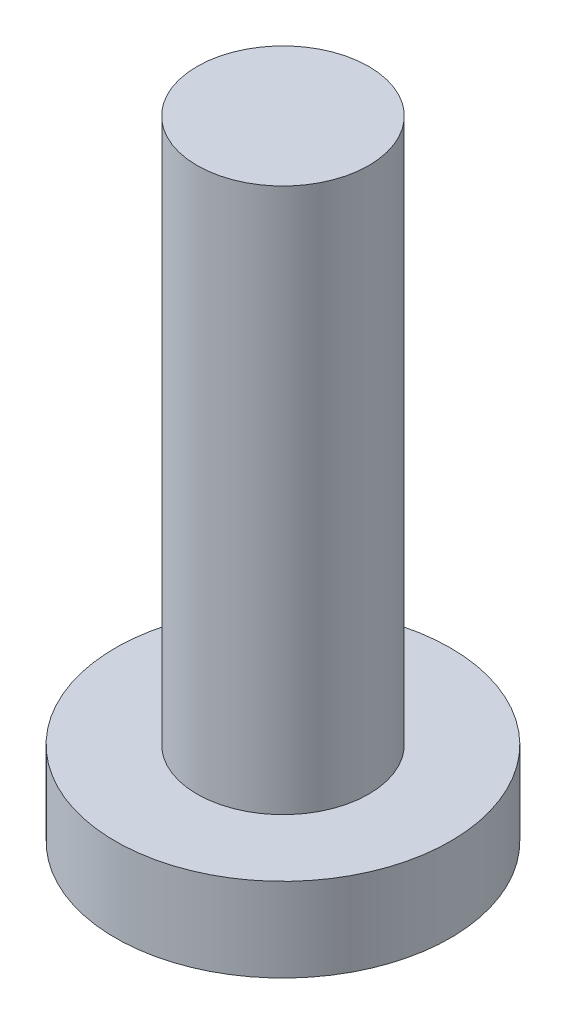
ISO-10303-21;
HEADER;
FILE_DESCRIPTION(('STEP AP214'),'2;1');
FILE_NAME('part.step','',(''),(''),'','','');
FILE_SCHEMA(('AUTOMOTIVE_DESIGN { 1 0 10303 214 1 1 1 1 }'));
ENDSEC;
DATA;
#1=APPLICATION_CONTEXT('core data for automotive mechanical design processes');
#2=APPLICATION_PROTOCOL_DEFINITION('international standard','automotive_design',2000,#1);
#3=PRODUCT_CONTEXT('',#1,'mechanical');
#4=PRODUCT('Part','Part','',(#3));
#5=PRODUCT_RELATED_PRODUCT_CATEGORY('part','',(#4));
#6=PRODUCT_DEFINITION_FORMATION('','',#4);
#7=PRODUCT_DEFINITION_CONTEXT('part definition',#1,'design');
#8=PRODUCT_DEFINITION('design','',#6,#7);
#9=PRODUCT_DEFINITION_SHAPE('','',#8);
#10=(LENGTH_UNIT() NAMED_UNIT(*) SI_UNIT(.MILLI.,.METRE.));
#11=(NAMED_UNIT(*) PLANE_ANGLE_UNIT() SI_UNIT($,.RADIAN.));
#12=(NAMED_UNIT(*) SI_UNIT($,.STERADIAN.) SOLID_ANGLE_UNIT());
#13=UNCERTAINTY_MEASURE_WITH_UNIT(LENGTH_MEASURE(1.E-05),#10,'distance_accuracy_value','');
#14=(GEOMETRIC_REPRESENTATION_CONTEXT(3) GLOBAL_UNCERTAINTY_ASSIGNED_CONTEXT((#13)) GLOBAL_UNIT_ASSIGNED_CONTEXT((#10,
#11,#12)) REPRESENTATION_CONTEXT('',''));
#15=CARTESIAN_POINT('',(0.,0.,0.));
#16=DIRECTION('',(0.,0.,1.));
#17=DIRECTION('',(1.,0.,0.));
#18=AXIS2_PLACEMENT_3D('',#15,#16,#17);
#19=CARTESIAN_POINT('',(0.,6.5,0.));
#20=DIRECTION('',(0.,-1.,0.));
#21=DIRECTION('',(0.,0.,-1.));
#22=AXIS2_PLACEMENT_3D('',#19,#20,#21);
#23=CYLINDRICAL_SURFACE('',#22,1.025);
#24=CARTESIAN_POINT('',(0.,6.5,0.));
#25=DIRECTION('',(0.,1.,0.));
#26=DIRECTION('',(0.,0.,1.));
#27=AXIS2_PLACEMENT_3D('',#24,#25,#26);
#28=CIRCLE('',#27,1.025);
#29=CARTESIAN_POINT('',(0.,6.5,-1.025));
#30=VERTEX_POINT('',#29);
#31=EDGE_CURVE('E10',#30,#30,#28,.T.);
#32=CARTESIAN_POINT('',(0.,0.,0.));
#33=DIRECTION('',(0.,-1.,0.));
#34=DIRECTION('',(0.,0.,-1.));
#35=AXIS2_PLACEMENT_3D('',#32,#33,#34);
#36=CIRCLE('',#35,1.025);
#37=CARTESIAN_POINT('',(0.,0.,-1.025));
#38=VERTEX_POINT('',#37);
#39=EDGE_CURVE('E37',#38,#38,#36,.T.);
#40=CARTESIAN_POINT('',(0.,6.5,-1.025));
#41=CARTESIAN_POINT('',(0.,6.43229166666667,-1.025));
#42=CARTESIAN_POINT('',(0.,6.36458333333333,-1.025));
#43=CARTESIAN_POINT('',(0.,6.22916666666667,-1.025));
#44=CARTESIAN_POINT('',(0.,6.16145833333333,-1.025));
#45=CARTESIAN_POINT('',(0.,6.02604166666667,-1.025));
#46=CARTESIAN_POINT('',(0.,5.95833333333333,-1.025));
#47=CARTESIAN_POINT('',(0.,5.82291666666667,-1.025));
#48=CARTESIAN_POINT('',(0.,5.75520833333333,-1.025));
#49=CARTESIAN_POINT('',(0.,5.61979166666667,-1.025));
#50=CARTESIAN_POINT('',(0.,5.55208333333333,-1.025));
#51=CARTESIAN_POINT('',(0.,5.41666666666667,-1.025));
#52=CARTESIAN_POINT('',(0.,5.34895833333333,-1.025));
#53=CARTESIAN_POINT('',(0.,5.21354166666667,-1.025));
#54=CARTESIAN_POINT('',(0.,5.14583333333333,-1.025));
#55=CARTESIAN_POINT('',(0.,5.01041666666667,-1.025));
#56=CARTESIAN_POINT('',(0.,4.94270833333333,-1.025));
#57=CARTESIAN_POINT('',(0.,4.80729166666667,-1.025));
#58=CARTESIAN_POINT('',(0.,4.73958333333333,-1.025));
#59=CARTESIAN_POINT('',(0.,4.60416666666667,-1.025));
#60=CARTESIAN_POINT('',(0.,4.53645833333333,-1.025));
#61=CARTESIAN_POINT('',(0.,4.40104166666667,-1.025));
#62=CARTESIAN_POINT('',(0.,4.33333333333333,-1.025));
#63=CARTESIAN_POINT('',(0.,4.19791666666667,-1.025));
#64=CARTESIAN_POINT('',(0.,4.13020833333333,-1.025));
#65=CARTESIAN_POINT('',(0.,3.99479166666667,-1.025));
#66=CARTESIAN_POINT('',(0.,3.92708333333333,-1.025));
#67=CARTESIAN_POINT('',(0.,3.79166666666667,-1.025));
#68=CARTESIAN_POINT('',(0.,3.72395833333333,-1.025));
#69=CARTESIAN_POINT('',(0.,3.58854166666667,-1.025));
#70=CARTESIAN_POINT('',(0.,3.52083333333333,-1.025));
#71=CARTESIAN_POINT('',(0.,3.38541666666667,-1.025));
#72=CARTESIAN_POINT('',(0.,3.31770833333333,-1.025));
#73=CARTESIAN_POINT('',(0.,3.18229166666667,-1.025));
#74=CARTESIAN_POINT('',(0.,3.11458333333333,-1.025));
#75=CARTESIAN_POINT('',(0.,2.97916666666667,-1.025));
#76=CARTESIAN_POINT('',(0.,2.91145833333333,-1.025));
#77=CARTESIAN_POINT('',(0.,2.77604166666667,-1.025));
#78=CARTESIAN_POINT('',(0.,2.70833333333333,-1.025));
#79=CARTESIAN_POINT('',(0.,2.57291666666667,-1.025));
#80=CARTESIAN_POINT('',(0.,2.50520833333333,-1.025));
#81=CARTESIAN_POINT('',(0.,2.36979166666667,-1.025));
#82=CARTESIAN_POINT('',(0.,2.30208333333333,-1.025));
#83=CARTESIAN_POINT('',(0.,2.16666666666667,-1.025));
#84=CARTESIAN_POINT('',(0.,2.09895833333333,-1.025));
#85=CARTESIAN_POINT('',(0.,1.96354166666667,-1.025));
#86=CARTESIAN_POINT('',(0.,1.89583333333333,-1.025));
#87=CARTESIAN_POINT('',(0.,1.76041666666667,-1.025));
#88=CARTESIAN_POINT('',(0.,1.69270833333333,-1.025));
#89=CARTESIAN_POINT('',(0.,1.55729166666667,-1.025));
#90=CARTESIAN_POINT('',(0.,1.48958333333333,-1.025));
#91=CARTESIAN_POINT('',(0.,1.35416666666667,-1.025));
#92=CARTESIAN_POINT('',(0.,1.28645833333333,-1.025));
#93=CARTESIAN_POINT('',(0.,1.15104166666667,-1.025));
#94=CARTESIAN_POINT('',(0.,1.08333333333333,-1.025));
#95=CARTESIAN_POINT('',(0.,0.947916666666667,-1.025));
#96=CARTESIAN_POINT('',(0.,0.880208333333333,-1.025));
#97=CARTESIAN_POINT('',(0.,0.744791666666667,-1.025));
#98=CARTESIAN_POINT('',(0.,0.677083333333333,-1.025));
#99=CARTESIAN_POINT('',(0.,0.541666666666667,-1.025));
#100=CARTESIAN_POINT('',(0.,0.473958333333333,-1.025));
#101=CARTESIAN_POINT('',(0.,0.338541666666667,-1.025));
#102=CARTESIAN_POINT('',(0.,0.270833333333334,-1.025));
#103=CARTESIAN_POINT('',(0.,0.135416666666667,-1.025));
#104=CARTESIAN_POINT('',(0.,0.0677083333333334,-1.025));
#105=CARTESIAN_POINT('',(0.,0.,-1.025));
#106=B_SPLINE_CURVE_WITH_KNOTS('',3,(#40,#41,#42,#43,#44,#45,#46,#47,#48,#49,#50,#51,#52,#53,
#54,#55,#56,#57,#58,#59,#60,#61,#62,#63,#64,#65,#66,#67,#68,#69,#70,#71,#72,#73,#74,#75,#76,#77,
#78,#79,#80,#81,#82,#83,#84,#85,#86,#87,#88,#89,#90,#91,#92,#93,#94,#95,#96,#97,#98,#99,#100,
#101,#102,#103,#104,#105),.UNSPECIFIED.,.F.,.F.,(4,2,2,2,2,2,2,2,2,2,2,2,2,2,2,2,2,2,2,2,2,2,2,
2,2,2,2,2,2,2,2,2,4),(0.,0.203125,0.40625,0.609375000000001,0.812500000000001,1.015625,1.21875,
1.421875,1.625,1.828125,2.03125,2.234375,2.4375,2.640625,2.84375,3.046875,3.25,3.453125,3.65625,
3.859375,4.0625,4.265625,4.46875,4.671875,4.875,5.078125,5.28125,5.484375,5.6875,5.890625,
6.09375,6.296875,6.5),.UNSPECIFIED.);
#107=EDGE_CURVE('BSEAM31',#30,#38,#106,.T.);
#108=ORIENTED_EDGE('',*,*,#31,.F.);
#109=ORIENTED_EDGE('',*,*,#39,.F.);
#110=ORIENTED_EDGE('',*,*,#107,.T.);
#111=ORIENTED_EDGE('',*,*,#107,.F.);
#112=EDGE_LOOP('',(#108,#110,#109,#111));
#113=FACE_BOUND('',#112,.T.);
#114=ADVANCED_FACE('F31',(#113),#23,.T.);
#115=CARTESIAN_POINT('',(0.,6.5,0.));
#116=DIRECTION('',(0.,1.,0.));
#117=DIRECTION('',(0.,0.,1.));
#118=AXIS2_PLACEMENT_3D('',#115,#116,#117);
#119=PLANE('',#118);
#120=ORIENTED_EDGE('',*,*,#31,.T.);
#121=EDGE_LOOP('',(#120));
#122=FACE_BOUND('',#121,.T.);
#123=ADVANCED_FACE('F64',(#122),#119,.T.);
#124=CARTESIAN_POINT('',(0.,-1.,0.));
#125=DIRECTION('',(0.,1.,0.));
#126=DIRECTION('',(0.,0.,1.));
#127=AXIS2_PLACEMENT_3D('',#124,#125,#126);
#128=CYLINDRICAL_SURFACE('',#127,2.);
#129=CARTESIAN_POINT('',(0.,-1.,0.));
#130=DIRECTION('',(0.,-1.,0.));
#131=DIRECTION('',(0.,0.,-1.));
#132=AXIS2_PLACEMENT_3D('',#129,#130,#131);
#133=CIRCLE('',#132,2.);
#134=CARTESIAN_POINT('',(0.,-1.,-2.));
#135=VERTEX_POINT('',#134);
#136=EDGE_CURVE('E41',#135,#135,#133,.T.);
#137=ORIENTED_EDGE('',*,*,#136,.F.);
#138=EDGE_LOOP('',(#137));
#139=FACE_BOUND('',#138,.T.);
#140=CARTESIAN_POINT('',(0.,0.,0.));
#141=DIRECTION('',(0.,-1.,0.));
#142=DIRECTION('',(0.,0.,-1.));
#143=AXIS2_PLACEMENT_3D('',#140,#141,#142);
#144=CIRCLE('',#143,2.);
#145=CARTESIAN_POINT('',(0.,0.,-2.));
#146=VERTEX_POINT('',#145);
#147=EDGE_CURVE('E45',#146,#146,#144,.T.);
#148=ORIENTED_EDGE('',*,*,#147,.T.);
#149=EDGE_LOOP('',(#148));
#150=FACE_BOUND('',#149,.T.);
#151=ADVANCED_FACE('F51',(#139,#150),#128,.T.);
#152=CARTESIAN_POINT('',(0.,-1.,0.));
#153=DIRECTION('',(0.,-1.,0.));
#154=DIRECTION('',(0.,0.,-1.));
#155=AXIS2_PLACEMENT_3D('',#152,#153,#154);
#156=PLANE('',#155);
#157=ORIENTED_EDGE('',*,*,#136,.T.);
#158=EDGE_LOOP('',(#157));
#159=FACE_BOUND('',#158,.T.);
#160=ADVANCED_FACE('F55',(#159),#156,.T.);
#161=CARTESIAN_POINT('',(0.,0.,0.));
#162=DIRECTION('',(0.,-1.,0.));
#163=DIRECTION('',(0.,0.,-1.));
#164=AXIS2_PLACEMENT_3D('',#161,#162,#163);
#165=PLANE('',#164);
#166=ORIENTED_EDGE('',*,*,#39,.T.);
#167=EDGE_LOOP('',(#166));
#168=FACE_BOUND('',#167,.T.);
#169=ORIENTED_EDGE('',*,*,#147,.F.);
#170=EDGE_LOOP('',(#169));
#171=FACE_BOUND('',#170,.T.);
#172=ADVANCED_FACE('F53',(#168,#171),#165,.F.);
#173=CLOSED_SHELL('',(#114,#123,#151,#160,#172));
#174=MANIFOLD_SOLID_BREP('B2',#173);
#175=ADVANCED_BREP_SHAPE_REPRESENTATION('',(#18,#174),#14);
#176=SHAPE_DEFINITION_REPRESENTATION(#9,#175);
ENDSEC;
END-ISO-10303-21;
